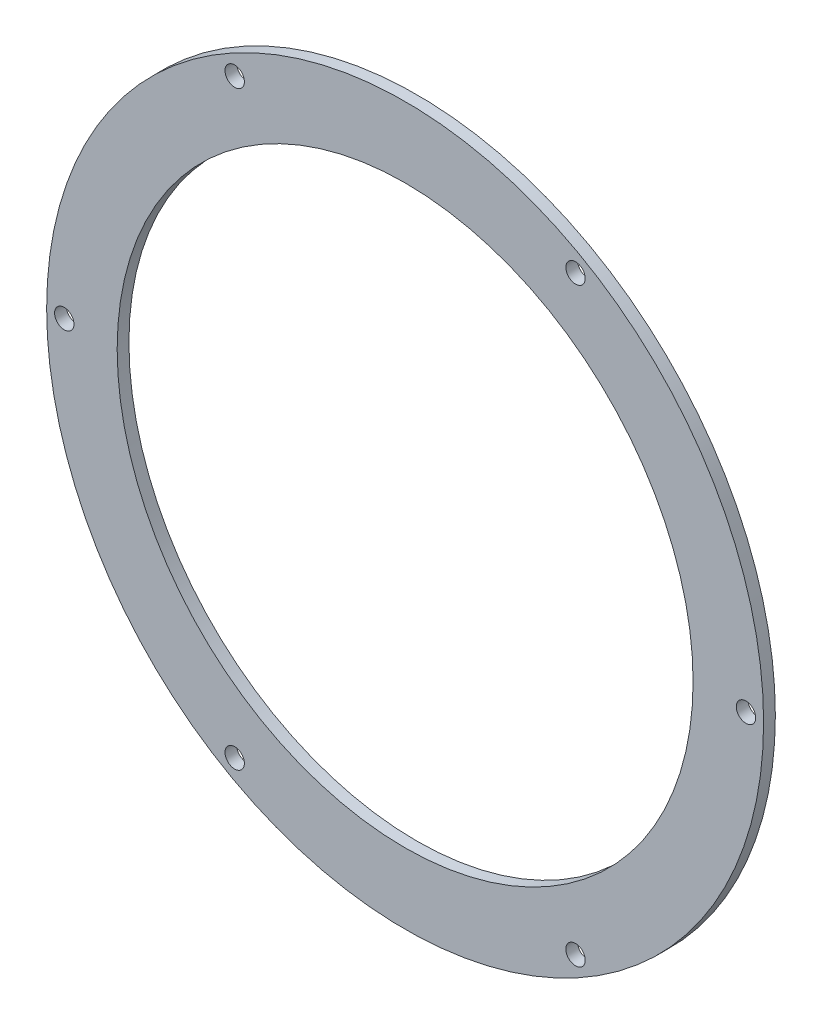
ISO-10303-21;
HEADER;
FILE_DESCRIPTION(('STEP AP214'),'2;1');
FILE_NAME('part.step','',(''),(''),'','','');
FILE_SCHEMA(('AUTOMOTIVE_DESIGN { 1 0 10303 214 1 1 1 1 }'));
ENDSEC;
DATA;
#1=APPLICATION_CONTEXT('core data for automotive mechanical design processes');
#2=APPLICATION_PROTOCOL_DEFINITION('international standard','automotive_design',2000,#1);
#3=PRODUCT_CONTEXT('',#1,'mechanical');
#4=PRODUCT('Part','Part','',(#3));
#5=PRODUCT_RELATED_PRODUCT_CATEGORY('part','',(#4));
#6=PRODUCT_DEFINITION_FORMATION('','',#4);
#7=PRODUCT_DEFINITION_CONTEXT('part definition',#1,'design');
#8=PRODUCT_DEFINITION('design','',#6,#7);
#9=PRODUCT_DEFINITION_SHAPE('','',#8);
#10=(LENGTH_UNIT() NAMED_UNIT(*) SI_UNIT(.MILLI.,.METRE.));
#11=(NAMED_UNIT(*) PLANE_ANGLE_UNIT() SI_UNIT($,.RADIAN.));
#12=(NAMED_UNIT(*) SI_UNIT($,.STERADIAN.) SOLID_ANGLE_UNIT());
#13=UNCERTAINTY_MEASURE_WITH_UNIT(LENGTH_MEASURE(1.E-05),#10,'distance_accuracy_value','');
#14=(GEOMETRIC_REPRESENTATION_CONTEXT(3) GLOBAL_UNCERTAINTY_ASSIGNED_CONTEXT((#13)) GLOBAL_UNIT_ASSIGNED_CONTEXT((#10,
#11,#12)) REPRESENTATION_CONTEXT('',''));
#15=CARTESIAN_POINT('',(0.,0.,0.));
#16=DIRECTION('',(0.,0.,1.));
#17=DIRECTION('',(1.,0.,0.));
#18=AXIS2_PLACEMENT_3D('',#15,#16,#17);
#19=CARTESIAN_POINT('',(0.,0.,22.));
#20=DIRECTION('',(0.,0.,1.));
#21=DIRECTION('',(1.,0.,0.));
#22=AXIS2_PLACEMENT_3D('',#19,#20,#21);
#23=PLANE('',#22);
#24=CARTESIAN_POINT('',(58.,0.,22.));
#25=DIRECTION('',(0.,0.,1.));
#26=DIRECTION('',(1.,0.,0.));
#27=AXIS2_PLACEMENT_3D('',#24,#25,#26);
#28=CIRCLE('',#27,1.65);
#29=CARTESIAN_POINT('',(59.65,0.,22.));
#30=VERTEX_POINT('',#29);
#31=EDGE_CURVE('E96',#30,#30,#28,.T.);
#32=ORIENTED_EDGE('',*,*,#31,.F.);
#33=EDGE_LOOP('',(#32));
#34=FACE_BOUND('',#33,.T.);
#35=CARTESIAN_POINT('',(29.,-50.2294734194974,22.));
#36=DIRECTION('',(0.,0.,1.));
#37=DIRECTION('',(1.,0.,0.));
#38=AXIS2_PLACEMENT_3D('',#35,#36,#37);
#39=CIRCLE('',#38,1.65);
#40=CARTESIAN_POINT('',(30.65,-50.2294734194974,22.));
#41=VERTEX_POINT('',#40);
#42=EDGE_CURVE('E80',#41,#41,#39,.T.);
#43=ORIENTED_EDGE('',*,*,#42,.F.);
#44=EDGE_LOOP('',(#43));
#45=FACE_BOUND('',#44,.T.);
#46=CARTESIAN_POINT('',(-29.,-50.2294734194974,22.));
#47=DIRECTION('',(0.,0.,1.));
#48=DIRECTION('',(1.,0.,0.));
#49=AXIS2_PLACEMENT_3D('',#46,#47,#48);
#50=CIRCLE('',#49,1.65);
#51=CARTESIAN_POINT('',(-27.35,-50.2294734194974,22.));
#52=VERTEX_POINT('',#51);
#53=EDGE_CURVE('E77',#52,#52,#50,.T.);
#54=ORIENTED_EDGE('',*,*,#53,.F.);
#55=EDGE_LOOP('',(#54));
#56=FACE_BOUND('',#55,.T.);
#57=CARTESIAN_POINT('',(-58.,0.,22.));
#58=DIRECTION('',(0.,0.,1.));
#59=DIRECTION('',(1.,0.,0.));
#60=AXIS2_PLACEMENT_3D('',#57,#58,#59);
#61=CIRCLE('',#60,1.65);
#62=CARTESIAN_POINT('',(-56.35,0.,22.));
#63=VERTEX_POINT('',#62);
#64=EDGE_CURVE('E73',#63,#63,#61,.T.);
#65=ORIENTED_EDGE('',*,*,#64,.F.);
#66=EDGE_LOOP('',(#65));
#67=FACE_BOUND('',#66,.T.);
#68=CARTESIAN_POINT('',(-29.,50.2294734194974,22.));
#69=DIRECTION('',(0.,0.,1.));
#70=DIRECTION('',(1.,0.,0.));
#71=AXIS2_PLACEMENT_3D('',#68,#69,#70);
#72=CIRCLE('',#71,1.65);
#73=CARTESIAN_POINT('',(-27.35,50.2294734194974,22.));
#74=VERTEX_POINT('',#73);
#75=EDGE_CURVE('E68',#74,#74,#72,.T.);
#76=ORIENTED_EDGE('',*,*,#75,.F.);
#77=EDGE_LOOP('',(#76));
#78=FACE_BOUND('',#77,.T.);
#79=CARTESIAN_POINT('',(29.,50.2294734194974,22.));
#80=DIRECTION('',(0.,0.,1.));
#81=DIRECTION('',(1.,0.,0.));
#82=AXIS2_PLACEMENT_3D('',#79,#80,#81);
#83=CIRCLE('',#82,1.65);
#84=CARTESIAN_POINT('',(30.65,50.2294734194974,22.));
#85=VERTEX_POINT('',#84);
#86=EDGE_CURVE('E63',#85,#85,#83,.T.);
#87=ORIENTED_EDGE('',*,*,#86,.F.);
#88=EDGE_LOOP('',(#87));
#89=FACE_BOUND('',#88,.T.);
#90=CARTESIAN_POINT('',(0.,0.,22.));
#91=DIRECTION('',(0.,0.,1.));
#92=DIRECTION('',(1.,0.,0.));
#93=AXIS2_PLACEMENT_3D('',#90,#91,#92);
#94=CIRCLE('',#93,61.);
#95=CARTESIAN_POINT('',(61.,0.,22.));
#96=VERTEX_POINT('',#95);
#97=EDGE_CURVE('E10',#96,#96,#94,.T.);
#98=ORIENTED_EDGE('',*,*,#97,.T.);
#99=EDGE_LOOP('',(#98));
#100=FACE_BOUND('',#99,.T.);
#101=CARTESIAN_POINT('',(0.,0.,22.));
#102=DIRECTION('',(0.,0.,1.));
#103=DIRECTION('',(1.,0.,0.));
#104=AXIS2_PLACEMENT_3D('',#101,#102,#103);
#105=CIRCLE('',#104,49.);
#106=CARTESIAN_POINT('',(49.,0.,22.));
#107=VERTEX_POINT('',#106);
#108=EDGE_CURVE('E53',#107,#107,#105,.T.);
#109=ORIENTED_EDGE('',*,*,#108,.F.);
#110=EDGE_LOOP('',(#109));
#111=FACE_BOUND('',#110,.T.);
#112=ADVANCED_FACE('F36',(#34,#45,#56,#67,#78,#89,#100,#111),#23,.T.);
#113=CARTESIAN_POINT('',(0.,0.,20.));
#114=DIRECTION('',(0.,0.,1.));
#115=DIRECTION('',(1.,0.,0.));
#116=AXIS2_PLACEMENT_3D('',#113,#114,#115);
#117=PLANE('',#116);
#118=CARTESIAN_POINT('',(58.,0.,20.));
#119=DIRECTION('',(0.,0.,1.));
#120=DIRECTION('',(1.,0.,0.));
#121=AXIS2_PLACEMENT_3D('',#118,#119,#120);
#122=CIRCLE('',#121,1.65);
#123=CARTESIAN_POINT('',(59.65,0.,20.));
#124=VERTEX_POINT('',#123);
#125=EDGE_CURVE('E40',#124,#124,#122,.T.);
#126=ORIENTED_EDGE('',*,*,#125,.T.);
#127=EDGE_LOOP('',(#126));
#128=FACE_BOUND('',#127,.T.);
#129=CARTESIAN_POINT('',(29.,-50.2294734194974,20.));
#130=DIRECTION('',(0.,0.,1.));
#131=DIRECTION('',(1.,0.,0.));
#132=AXIS2_PLACEMENT_3D('',#129,#130,#131);
#133=CIRCLE('',#132,1.65);
#134=CARTESIAN_POINT('',(30.65,-50.2294734194974,20.));
#135=VERTEX_POINT('',#134);
#136=EDGE_CURVE('E78',#135,#135,#133,.T.);
#137=ORIENTED_EDGE('',*,*,#136,.T.);
#138=EDGE_LOOP('',(#137));
#139=FACE_BOUND('',#138,.T.);
#140=CARTESIAN_POINT('',(-29.,-50.2294734194974,20.));
#141=DIRECTION('',(0.,0.,1.));
#142=DIRECTION('',(1.,0.,0.));
#143=AXIS2_PLACEMENT_3D('',#140,#141,#142);
#144=CIRCLE('',#143,1.65);
#145=CARTESIAN_POINT('',(-27.35,-50.2294734194974,20.));
#146=VERTEX_POINT('',#145);
#147=EDGE_CURVE('E74',#146,#146,#144,.T.);
#148=ORIENTED_EDGE('',*,*,#147,.T.);
#149=EDGE_LOOP('',(#148));
#150=FACE_BOUND('',#149,.T.);
#151=CARTESIAN_POINT('',(-58.,0.,20.));
#152=DIRECTION('',(0.,0.,1.));
#153=DIRECTION('',(1.,0.,0.));
#154=AXIS2_PLACEMENT_3D('',#151,#152,#153);
#155=CIRCLE('',#154,1.65);
#156=CARTESIAN_POINT('',(-56.35,0.,20.));
#157=VERTEX_POINT('',#156);
#158=EDGE_CURVE('E69',#157,#157,#155,.T.);
#159=ORIENTED_EDGE('',*,*,#158,.T.);
#160=EDGE_LOOP('',(#159));
#161=FACE_BOUND('',#160,.T.);
#162=CARTESIAN_POINT('',(-29.,50.2294734194974,20.));
#163=DIRECTION('',(0.,0.,1.));
#164=DIRECTION('',(1.,0.,0.));
#165=AXIS2_PLACEMENT_3D('',#162,#163,#164);
#166=CIRCLE('',#165,1.65);
#167=CARTESIAN_POINT('',(-27.35,50.2294734194974,20.));
#168=VERTEX_POINT('',#167);
#169=EDGE_CURVE('E64',#168,#168,#166,.T.);
#170=ORIENTED_EDGE('',*,*,#169,.T.);
#171=EDGE_LOOP('',(#170));
#172=FACE_BOUND('',#171,.T.);
#173=CARTESIAN_POINT('',(29.,50.2294734194974,20.));
#174=DIRECTION('',(0.,0.,1.));
#175=DIRECTION('',(1.,0.,0.));
#176=AXIS2_PLACEMENT_3D('',#173,#174,#175);
#177=CIRCLE('',#176,1.65);
#178=CARTESIAN_POINT('',(30.65,50.2294734194974,20.));
#179=VERTEX_POINT('',#178);
#180=EDGE_CURVE('E59',#179,#179,#177,.T.);
#181=ORIENTED_EDGE('',*,*,#180,.T.);
#182=EDGE_LOOP('',(#181));
#183=FACE_BOUND('',#182,.T.);
#184=CARTESIAN_POINT('',(0.,0.,20.));
#185=DIRECTION('',(0.,0.,1.));
#186=DIRECTION('',(1.,0.,0.));
#187=AXIS2_PLACEMENT_3D('',#184,#185,#186);
#188=CIRCLE('',#187,61.);
#189=CARTESIAN_POINT('',(61.,0.,20.));
#190=VERTEX_POINT('',#189);
#191=EDGE_CURVE('E45',#190,#190,#188,.T.);
#192=ORIENTED_EDGE('',*,*,#191,.F.);
#193=EDGE_LOOP('',(#192));
#194=FACE_BOUND('',#193,.T.);
#195=CARTESIAN_POINT('',(0.,0.,20.));
#196=DIRECTION('',(0.,0.,1.));
#197=DIRECTION('',(1.,0.,0.));
#198=AXIS2_PLACEMENT_3D('',#195,#196,#197);
#199=CIRCLE('',#198,49.);
#200=CARTESIAN_POINT('',(49.,0.,20.));
#201=VERTEX_POINT('',#200);
#202=EDGE_CURVE('E56',#201,#201,#199,.T.);
#203=ORIENTED_EDGE('',*,*,#202,.T.);
#204=EDGE_LOOP('',(#203));
#205=FACE_BOUND('',#204,.T.);
#206=ADVANCED_FACE('F105',(#128,#139,#150,#161,#172,#183,#194,#205),#117,.F.);
#207=CARTESIAN_POINT('',(0.,0.,22.));
#208=DIRECTION('',(0.,0.,-1.));
#209=DIRECTION('',(-1.,0.,0.));
#210=AXIS2_PLACEMENT_3D('',#207,#208,#209);
#211=CYLINDRICAL_SURFACE('',#210,61.);
#212=ORIENTED_EDGE('',*,*,#97,.F.);
#213=EDGE_LOOP('',(#212));
#214=FACE_BOUND('',#213,.T.);
#215=ORIENTED_EDGE('',*,*,#191,.T.);
#216=EDGE_LOOP('',(#215));
#217=FACE_BOUND('',#216,.T.);
#218=ADVANCED_FACE('F38',(#214,#217),#211,.T.);
#219=CARTESIAN_POINT('',(0.,0.,22.));
#220=DIRECTION('',(0.,0.,-1.));
#221=DIRECTION('',(-1.,0.,0.));
#222=AXIS2_PLACEMENT_3D('',#219,#220,#221);
#223=CYLINDRICAL_SURFACE('',#222,49.);
#224=ORIENTED_EDGE('',*,*,#108,.T.);
#225=EDGE_LOOP('',(#224));
#226=FACE_BOUND('',#225,.T.);
#227=ORIENTED_EDGE('',*,*,#202,.F.);
#228=EDGE_LOOP('',(#227));
#229=FACE_BOUND('',#228,.T.);
#230=ADVANCED_FACE('F107',(#226,#229),#223,.F.);
#231=CARTESIAN_POINT('',(29.,50.2294734194974,-100.));
#232=DIRECTION('',(0.,0.,1.));
#233=DIRECTION('',(1.,0.,0.));
#234=AXIS2_PLACEMENT_3D('',#231,#232,#233);
#235=CYLINDRICAL_SURFACE('',#234,1.65);
#236=ORIENTED_EDGE('',*,*,#86,.T.);
#237=EDGE_LOOP('',(#236));
#238=FACE_BOUND('',#237,.T.);
#239=ORIENTED_EDGE('',*,*,#180,.F.);
#240=EDGE_LOOP('',(#239));
#241=FACE_BOUND('',#240,.T.);
#242=ADVANCED_FACE('F109',(#238,#241),#235,.F.);
#243=CARTESIAN_POINT('',(-29.,50.2294734194974,-100.));
#244=DIRECTION('',(0.,0.,1.));
#245=DIRECTION('',(1.,0.,0.));
#246=AXIS2_PLACEMENT_3D('',#243,#244,#245);
#247=CYLINDRICAL_SURFACE('',#246,1.65);
#248=ORIENTED_EDGE('',*,*,#75,.T.);
#249=EDGE_LOOP('',(#248));
#250=FACE_BOUND('',#249,.T.);
#251=ORIENTED_EDGE('',*,*,#169,.F.);
#252=EDGE_LOOP('',(#251));
#253=FACE_BOUND('',#252,.T.);
#254=ADVANCED_FACE('F115',(#250,#253),#247,.F.);
#255=CARTESIAN_POINT('',(-58.,0.,-100.));
#256=DIRECTION('',(0.,0.,1.));
#257=DIRECTION('',(1.,0.,0.));
#258=AXIS2_PLACEMENT_3D('',#255,#256,#257);
#259=CYLINDRICAL_SURFACE('',#258,1.65);
#260=ORIENTED_EDGE('',*,*,#64,.T.);
#261=EDGE_LOOP('',(#260));
#262=FACE_BOUND('',#261,.T.);
#263=ORIENTED_EDGE('',*,*,#158,.F.);
#264=EDGE_LOOP('',(#263));
#265=FACE_BOUND('',#264,.T.);
#266=ADVANCED_FACE('F148',(#262,#265),#259,.F.);
#267=CARTESIAN_POINT('',(-29.,-50.2294734194974,-100.));
#268=DIRECTION('',(0.,0.,1.));
#269=DIRECTION('',(1.,0.,0.));
#270=AXIS2_PLACEMENT_3D('',#267,#268,#269);
#271=CYLINDRICAL_SURFACE('',#270,1.65);
#272=ORIENTED_EDGE('',*,*,#53,.T.);
#273=EDGE_LOOP('',(#272));
#274=FACE_BOUND('',#273,.T.);
#275=ORIENTED_EDGE('',*,*,#147,.F.);
#276=EDGE_LOOP('',(#275));
#277=FACE_BOUND('',#276,.T.);
#278=ADVANCED_FACE('F161',(#274,#277),#271,.F.);
#279=CARTESIAN_POINT('',(29.,-50.2294734194974,-100.));
#280=DIRECTION('',(0.,0.,1.));
#281=DIRECTION('',(1.,0.,0.));
#282=AXIS2_PLACEMENT_3D('',#279,#280,#281);
#283=CYLINDRICAL_SURFACE('',#282,1.65);
#284=ORIENTED_EDGE('',*,*,#42,.T.);
#285=EDGE_LOOP('',(#284));
#286=FACE_BOUND('',#285,.T.);
#287=ORIENTED_EDGE('',*,*,#136,.F.);
#288=EDGE_LOOP('',(#287));
#289=FACE_BOUND('',#288,.T.);
#290=ADVANCED_FACE('F166',(#286,#289),#283,.F.);
#291=CARTESIAN_POINT('',(58.,0.,-100.));
#292=DIRECTION('',(0.,0.,1.));
#293=DIRECTION('',(1.,0.,0.));
#294=AXIS2_PLACEMENT_3D('',#291,#292,#293);
#295=CYLINDRICAL_SURFACE('',#294,1.65);
#296=ORIENTED_EDGE('',*,*,#31,.T.);
#297=EDGE_LOOP('',(#296));
#298=FACE_BOUND('',#297,.T.);
#299=ORIENTED_EDGE('',*,*,#125,.F.);
#300=EDGE_LOOP('',(#299));
#301=FACE_BOUND('',#300,.T.);
#302=ADVANCED_FACE('F170',(#298,#301),#295,.F.);
#303=CLOSED_SHELL('',(#112,#206,#218,#230,#242,#254,#266,#278,#290,#302));
#304=MANIFOLD_SOLID_BREP('B2',#303);
#305=ADVANCED_BREP_SHAPE_REPRESENTATION('',(#18,#304),#14);
#306=SHAPE_DEFINITION_REPRESENTATION(#9,#305);
ENDSEC;
END-ISO-10303-21;
